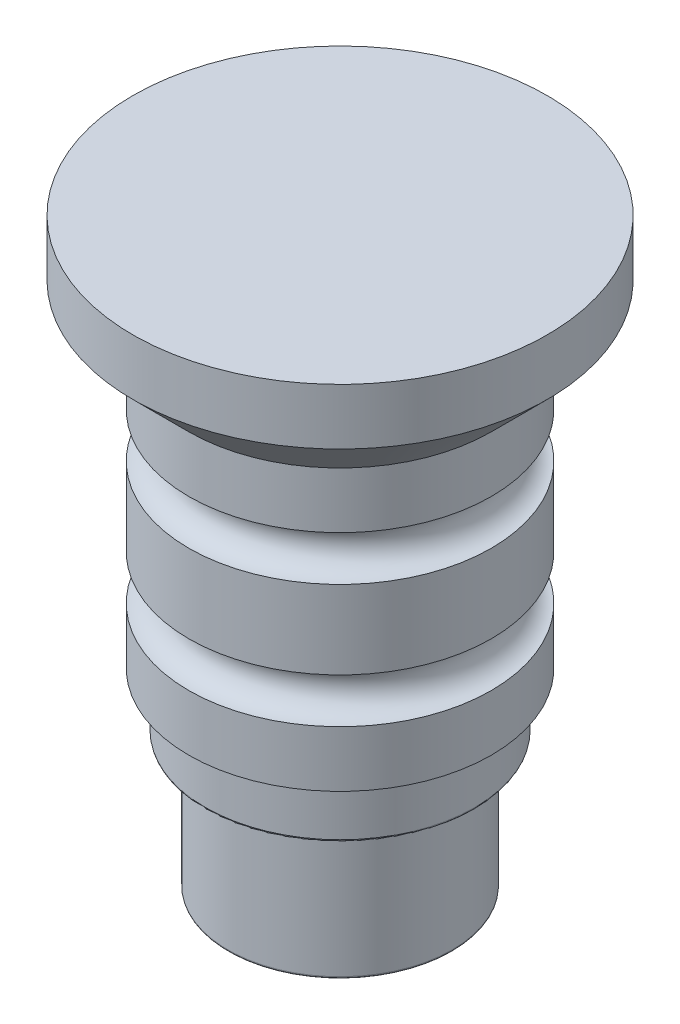
ISO-10303-21;
HEADER;
FILE_DESCRIPTION(('STEP AP214'),'2;1');
FILE_NAME('part.step','',(''),(''),'','','');
FILE_SCHEMA(('AUTOMOTIVE_DESIGN { 1 0 10303 214 1 1 1 1 }'));
ENDSEC;
DATA;
#1=APPLICATION_CONTEXT('core data for automotive mechanical design processes');
#2=APPLICATION_PROTOCOL_DEFINITION('international standard','automotive_design',2000,#1);
#3=PRODUCT_CONTEXT('',#1,'mechanical');
#4=PRODUCT('Part','Part','',(#3));
#5=PRODUCT_RELATED_PRODUCT_CATEGORY('part','',(#4));
#6=PRODUCT_DEFINITION_FORMATION('','',#4);
#7=PRODUCT_DEFINITION_CONTEXT('part definition',#1,'design');
#8=PRODUCT_DEFINITION('design','',#6,#7);
#9=PRODUCT_DEFINITION_SHAPE('','',#8);
#10=(LENGTH_UNIT() NAMED_UNIT(*) SI_UNIT(.MILLI.,.METRE.));
#11=(NAMED_UNIT(*) PLANE_ANGLE_UNIT() SI_UNIT($,.RADIAN.));
#12=(NAMED_UNIT(*) SI_UNIT($,.STERADIAN.) SOLID_ANGLE_UNIT());
#13=UNCERTAINTY_MEASURE_WITH_UNIT(LENGTH_MEASURE(1.E-05),#10,'distance_accuracy_value','');
#14=(GEOMETRIC_REPRESENTATION_CONTEXT(3) GLOBAL_UNCERTAINTY_ASSIGNED_CONTEXT((#13)) GLOBAL_UNIT_ASSIGNED_CONTEXT((#10,
#11,#12)) REPRESENTATION_CONTEXT('',''));
#15=CARTESIAN_POINT('',(0.,0.,0.));
#16=DIRECTION('',(0.,0.,1.));
#17=DIRECTION('',(1.,0.,0.));
#18=AXIS2_PLACEMENT_3D('',#15,#16,#17);
#19=CARTESIAN_POINT('',(-7.5,0.,0.));
#20=DIRECTION('',(0.,-1.,0.));
#21=DIRECTION('',(1.,0.,0.));
#22=AXIS2_PLACEMENT_3D('',#19,#20,#21);
#23=PLANE('',#22);
#24=CARTESIAN_POINT('',(0.,0.,0.));
#25=DIRECTION('',(0.,-1.,0.));
#26=DIRECTION('',(1.,0.,0.));
#27=AXIS2_PLACEMENT_3D('',#24,#25,#26);
#28=CIRCLE('',#27,9.8);
#29=CARTESIAN_POINT('',(9.8,0.,0.));
#30=VERTEX_POINT('',#29);
#31=EDGE_CURVE('E42',#30,#30,#28,.T.);
#32=ORIENTED_EDGE('',*,*,#31,.T.);
#33=EDGE_LOOP('',(#32));
#34=FACE_BOUND('',#33,.T.);
#35=ADVANCED_FACE('F35',(#34),#23,.T.);
#36=CARTESIAN_POINT('',(0.,42.,0.));
#37=DIRECTION('',(0.,1.,0.));
#38=DIRECTION('',(-1.,0.,0.));
#39=AXIS2_PLACEMENT_3D('',#36,#37,#38);
#40=CYLINDRICAL_SURFACE('',#39,10.);
#41=CARTESIAN_POINT('',(0.,11.8,0.));
#42=DIRECTION('',(0.,-1.,0.));
#43=DIRECTION('',(1.,0.,0.));
#44=AXIS2_PLACEMENT_3D('',#41,#42,#43);
#45=CIRCLE('',#44,10.);
#46=CARTESIAN_POINT('',(10.,11.8,0.));
#47=VERTEX_POINT('',#46);
#48=EDGE_CURVE('E46',#47,#47,#45,.T.);
#49=ORIENTED_EDGE('',*,*,#48,.T.);
#50=EDGE_LOOP('',(#49));
#51=FACE_BOUND('',#50,.T.);
#52=CARTESIAN_POINT('',(0.,0.199999999999999,0.));
#53=DIRECTION('',(0.,-1.,0.));
#54=DIRECTION('',(1.,0.,0.));
#55=AXIS2_PLACEMENT_3D('',#52,#53,#54);
#56=CIRCLE('',#55,10.);
#57=CARTESIAN_POINT('',(10.,0.199999999999999,0.));
#58=VERTEX_POINT('',#57);
#59=EDGE_CURVE('E50',#58,#58,#56,.F.);
#60=ORIENTED_EDGE('',*,*,#59,.T.);
#61=EDGE_LOOP('',(#60));
#62=FACE_BOUND('',#61,.T.);
#63=ADVANCED_FACE('F106',(#51,#62),#40,.T.);
#64=CARTESIAN_POINT('',(-10.,12.,0.));
#65=DIRECTION('',(0.,-1.,0.));
#66=DIRECTION('',(1.,0.,0.));
#67=AXIS2_PLACEMENT_3D('',#64,#65,#66);
#68=PLANE('',#67);
#69=CARTESIAN_POINT('',(0.,12.,0.));
#70=DIRECTION('',(0.,-1.,0.));
#71=DIRECTION('',(1.,0.,0.));
#72=AXIS2_PLACEMENT_3D('',#69,#70,#71);
#73=CIRCLE('',#72,10.2);
#74=CARTESIAN_POINT('',(10.2,12.,0.));
#75=VERTEX_POINT('',#74);
#76=EDGE_CURVE('E55',#75,#75,#73,.F.);
#77=ORIENTED_EDGE('',*,*,#76,.T.);
#78=EDGE_LOOP('',(#77));
#79=FACE_BOUND('',#78,.T.);
#80=CARTESIAN_POINT('',(0.,12.,0.));
#81=DIRECTION('',(0.,-1.,0.));
#82=DIRECTION('',(1.,0.,0.));
#83=AXIS2_PLACEMENT_3D('',#80,#81,#82);
#84=CIRCLE('',#83,11.8);
#85=CARTESIAN_POINT('',(11.8,12.,0.));
#86=VERTEX_POINT('',#85);
#87=EDGE_CURVE('E58',#86,#86,#84,.T.);
#88=ORIENTED_EDGE('',*,*,#87,.T.);
#89=EDGE_LOOP('',(#88));
#90=FACE_BOUND('',#89,.T.);
#91=ADVANCED_FACE('F111',(#79,#90),#68,.T.);
#92=CARTESIAN_POINT('',(0.,42.,0.));
#93=DIRECTION('',(0.,1.,0.));
#94=DIRECTION('',(-1.,0.,0.));
#95=AXIS2_PLACEMENT_3D('',#92,#93,#94);
#96=CYLINDRICAL_SURFACE('',#95,12.);
#97=CARTESIAN_POINT('',(0.,12.2,0.));
#98=DIRECTION('',(0.,-1.,0.));
#99=DIRECTION('',(1.,0.,0.));
#100=AXIS2_PLACEMENT_3D('',#97,#98,#99);
#101=CIRCLE('',#100,12.);
#102=CARTESIAN_POINT('',(12.,12.2,0.));
#103=VERTEX_POINT('',#102);
#104=EDGE_CURVE('E10',#103,#103,#101,.F.);
#105=ORIENTED_EDGE('',*,*,#104,.T.);
#106=EDGE_LOOP('',(#105));
#107=FACE_BOUND('',#106,.T.);
#108=CARTESIAN_POINT('',(0.,17.,0.));
#109=DIRECTION('',(0.,1.,0.));
#110=DIRECTION('',(-1.,0.,0.));
#111=AXIS2_PLACEMENT_3D('',#108,#109,#110);
#112=CIRCLE('',#111,12.);
#113=CARTESIAN_POINT('',(-12.,17.,0.));
#114=VERTEX_POINT('',#113);
#115=EDGE_CURVE('E61',#114,#114,#112,.T.);
#116=ORIENTED_EDGE('',*,*,#115,.F.);
#117=EDGE_LOOP('',(#116));
#118=FACE_BOUND('',#117,.T.);
#119=ADVANCED_FACE('F134',(#107,#118),#96,.T.);
#120=CARTESIAN_POINT('',(-12.,17.,0.));
#121=DIRECTION('',(0.,-1.,0.));
#122=DIRECTION('',(1.,0.,0.));
#123=AXIS2_PLACEMENT_3D('',#120,#121,#122);
#124=PLANE('',#123);
#125=ORIENTED_EDGE('',*,*,#115,.T.);
#126=EDGE_LOOP('',(#125));
#127=FACE_BOUND('',#126,.T.);
#128=CARTESIAN_POINT('',(0.,17.,0.));
#129=DIRECTION('',(0.,1.,0.));
#130=DIRECTION('',(-1.,0.,0.));
#131=AXIS2_PLACEMENT_3D('',#128,#129,#130);
#132=CIRCLE('',#131,13.5);
#133=CARTESIAN_POINT('',(-13.5,17.,0.));
#134=VERTEX_POINT('',#133);
#135=EDGE_CURVE('E64',#134,#134,#132,.T.);
#136=ORIENTED_EDGE('',*,*,#135,.F.);
#137=EDGE_LOOP('',(#136));
#138=FACE_BOUND('',#137,.T.);
#139=ADVANCED_FACE('F139',(#127,#138),#124,.T.);
#140=CARTESIAN_POINT('',(0.,42.,0.));
#141=DIRECTION('',(0.,1.,0.));
#142=DIRECTION('',(-1.,0.,0.));
#143=AXIS2_PLACEMENT_3D('',#140,#141,#142);
#144=CYLINDRICAL_SURFACE('',#143,13.5);
#145=ORIENTED_EDGE('',*,*,#135,.T.);
#146=EDGE_LOOP('',(#145));
#147=FACE_BOUND('',#146,.T.);
#148=CARTESIAN_POINT('',(0.,22.,0.));
#149=DIRECTION('',(0.,1.,0.));
#150=DIRECTION('',(-1.,0.,0.));
#151=AXIS2_PLACEMENT_3D('',#148,#149,#150);
#152=CIRCLE('',#151,13.5);
#153=CARTESIAN_POINT('',(-13.5,22.,0.));
#154=VERTEX_POINT('',#153);
#155=EDGE_CURVE('E67',#154,#154,#152,.T.);
#156=ORIENTED_EDGE('',*,*,#155,.F.);
#157=EDGE_LOOP('',(#156));
#158=FACE_BOUND('',#157,.T.);
#159=ADVANCED_FACE('F144',(#147,#158),#144,.T.);
#160=CARTESIAN_POINT('',(0.,24.,0.));
#161=DIRECTION('',(0.,1.,0.));
#162=DIRECTION('',(-1.,0.,0.));
#163=AXIS2_PLACEMENT_3D('',#160,#161,#162);
#164=TOROIDAL_SURFACE('',#163,13.5,2.);
#165=ORIENTED_EDGE('',*,*,#155,.T.);
#166=EDGE_LOOP('',(#165));
#167=FACE_BOUND('',#166,.T.);
#168=CARTESIAN_POINT('',(0.,26.,0.));
#169=DIRECTION('',(0.,1.,0.));
#170=DIRECTION('',(-1.,0.,0.));
#171=AXIS2_PLACEMENT_3D('',#168,#169,#170);
#172=CIRCLE('',#171,13.5);
#173=CARTESIAN_POINT('',(-13.5,26.,0.));
#174=VERTEX_POINT('',#173);
#175=EDGE_CURVE('E70',#174,#174,#172,.T.);
#176=ORIENTED_EDGE('',*,*,#175,.F.);
#177=EDGE_LOOP('',(#176));
#178=FACE_BOUND('',#177,.T.);
#179=ADVANCED_FACE('F148',(#167,#178),#164,.F.);
#180=CARTESIAN_POINT('',(0.,42.,0.));
#181=DIRECTION('',(0.,1.,0.));
#182=DIRECTION('',(-1.,0.,0.));
#183=AXIS2_PLACEMENT_3D('',#180,#181,#182);
#184=CYLINDRICAL_SURFACE('',#183,13.5);
#185=ORIENTED_EDGE('',*,*,#175,.T.);
#186=EDGE_LOOP('',(#185));
#187=FACE_BOUND('',#186,.T.);
#188=CARTESIAN_POINT('',(0.,33.,0.));
#189=DIRECTION('',(0.,1.,0.));
#190=DIRECTION('',(-1.,0.,0.));
#191=AXIS2_PLACEMENT_3D('',#188,#189,#190);
#192=CIRCLE('',#191,13.5);
#193=CARTESIAN_POINT('',(-13.5,33.,0.));
#194=VERTEX_POINT('',#193);
#195=EDGE_CURVE('E73',#194,#194,#192,.T.);
#196=ORIENTED_EDGE('',*,*,#195,.F.);
#197=EDGE_LOOP('',(#196));
#198=FACE_BOUND('',#197,.T.);
#199=ADVANCED_FACE('F152',(#187,#198),#184,.T.);
#200=CARTESIAN_POINT('',(0.,35.,0.));
#201=DIRECTION('',(0.,1.,0.));
#202=DIRECTION('',(-1.,0.,0.));
#203=AXIS2_PLACEMENT_3D('',#200,#201,#202);
#204=TOROIDAL_SURFACE('',#203,13.5,2.);
#205=ORIENTED_EDGE('',*,*,#195,.T.);
#206=EDGE_LOOP('',(#205));
#207=FACE_BOUND('',#206,.T.);
#208=CARTESIAN_POINT('',(0.,37.,0.));
#209=DIRECTION('',(0.,1.,0.));
#210=DIRECTION('',(-1.,0.,0.));
#211=AXIS2_PLACEMENT_3D('',#208,#209,#210);
#212=CIRCLE('',#211,13.5);
#213=CARTESIAN_POINT('',(-13.5,37.,0.));
#214=VERTEX_POINT('',#213);
#215=EDGE_CURVE('E76',#214,#214,#212,.T.);
#216=ORIENTED_EDGE('',*,*,#215,.F.);
#217=EDGE_LOOP('',(#216));
#218=FACE_BOUND('',#217,.T.);
#219=ADVANCED_FACE('F156',(#207,#218),#204,.F.);
#220=CARTESIAN_POINT('',(0.,42.,0.));
#221=DIRECTION('',(0.,1.,0.));
#222=DIRECTION('',(-1.,0.,0.));
#223=AXIS2_PLACEMENT_3D('',#220,#221,#222);
#224=CYLINDRICAL_SURFACE('',#223,13.5);
#225=ORIENTED_EDGE('',*,*,#215,.T.);
#226=EDGE_LOOP('',(#225));
#227=FACE_BOUND('',#226,.T.);
#228=CARTESIAN_POINT('',(0.,42.,0.));
#229=DIRECTION('',(0.,1.,0.));
#230=DIRECTION('',(-1.,0.,0.));
#231=AXIS2_PLACEMENT_3D('',#228,#229,#230);
#232=CIRCLE('',#231,13.5);
#233=CARTESIAN_POINT('',(-13.5,42.,0.));
#234=VERTEX_POINT('',#233);
#235=EDGE_CURVE('E79',#234,#234,#232,.T.);
#236=ORIENTED_EDGE('',*,*,#235,.F.);
#237=EDGE_LOOP('',(#236));
#238=FACE_BOUND('',#237,.T.);
#239=ADVANCED_FACE('F102',(#227,#238),#224,.T.);
#240=CARTESIAN_POINT('',(0.,47.,0.));
#241=DIRECTION('',(0.,1.,0.));
#242=DIRECTION('',(-1.,0.,0.));
#243=AXIS2_PLACEMENT_3D('',#240,#241,#242);
#244=CONICAL_SURFACE('',#243,18.5000000000001,0.785398163397453);
#245=ORIENTED_EDGE('',*,*,#235,.T.);
#246=EDGE_LOOP('',(#245));
#247=FACE_BOUND('',#246,.T.);
#248=CARTESIAN_POINT('',(0.,47.,0.));
#249=DIRECTION('',(0.,1.,0.));
#250=DIRECTION('',(-1.,0.,0.));
#251=AXIS2_PLACEMENT_3D('',#248,#249,#250);
#252=CIRCLE('',#251,18.5000000000001);
#253=CARTESIAN_POINT('',(-18.5000000000001,47.,0.));
#254=VERTEX_POINT('',#253);
#255=EDGE_CURVE('E82',#254,#254,#252,.T.);
#256=ORIENTED_EDGE('',*,*,#255,.F.);
#257=EDGE_LOOP('',(#256));
#258=FACE_BOUND('',#257,.T.);
#259=ADVANCED_FACE('F93',(#247,#258),#244,.T.);
#260=CARTESIAN_POINT('',(0.,42.,0.));
#261=DIRECTION('',(0.,1.,0.));
#262=DIRECTION('',(-1.,0.,0.));
#263=AXIS2_PLACEMENT_3D('',#260,#261,#262);
#264=CYLINDRICAL_SURFACE('',#263,18.5000000000001);
#265=ORIENTED_EDGE('',*,*,#255,.T.);
#266=EDGE_LOOP('',(#265));
#267=FACE_BOUND('',#266,.T.);
#268=CARTESIAN_POINT('',(0.,52.,0.));
#269=DIRECTION('',(0.,1.,0.));
#270=DIRECTION('',(-1.,0.,0.));
#271=AXIS2_PLACEMENT_3D('',#268,#269,#270);
#272=CIRCLE('',#271,18.5000000000001);
#273=CARTESIAN_POINT('',(-18.5000000000001,52.,0.));
#274=VERTEX_POINT('',#273);
#275=EDGE_CURVE('E85',#274,#274,#272,.T.);
#276=ORIENTED_EDGE('',*,*,#275,.F.);
#277=EDGE_LOOP('',(#276));
#278=FACE_BOUND('',#277,.T.);
#279=ADVANCED_FACE('F91',(#267,#278),#264,.T.);
#280=CARTESIAN_POINT('',(-18.5000000000001,52.,0.));
#281=DIRECTION('',(0.,1.,0.));
#282=DIRECTION('',(-1.,0.,0.));
#283=AXIS2_PLACEMENT_3D('',#280,#281,#282);
#284=PLANE('',#283);
#285=ORIENTED_EDGE('',*,*,#275,.T.);
#286=EDGE_LOOP('',(#285));
#287=FACE_BOUND('',#286,.T.);
#288=ADVANCED_FACE('F89',(#287),#284,.T.);
#289=CARTESIAN_POINT('',(0.,11.8,0.));
#290=DIRECTION('',(0.,-1.,0.));
#291=DIRECTION('',(1.,0.,0.));
#292=AXIS2_PLACEMENT_3D('',#289,#290,#291);
#293=TOROIDAL_SURFACE('',#292,10.2,0.2);
#294=ORIENTED_EDGE('',*,*,#48,.F.);
#295=EDGE_LOOP('',(#294));
#296=FACE_BOUND('',#295,.T.);
#297=ORIENTED_EDGE('',*,*,#76,.F.);
#298=EDGE_LOOP('',(#297));
#299=FACE_BOUND('',#298,.T.);
#300=ADVANCED_FACE('F100',(#296,#299),#293,.F.);
#301=CARTESIAN_POINT('',(0.,0.199999999999999,0.));
#302=DIRECTION('',(0.,-1.,0.));
#303=DIRECTION('',(1.,0.,0.));
#304=AXIS2_PLACEMENT_3D('',#301,#302,#303);
#305=TOROIDAL_SURFACE('',#304,9.8,0.2);
#306=ORIENTED_EDGE('',*,*,#31,.F.);
#307=EDGE_LOOP('',(#306));
#308=FACE_BOUND('',#307,.T.);
#309=ORIENTED_EDGE('',*,*,#59,.F.);
#310=EDGE_LOOP('',(#309));
#311=FACE_BOUND('',#310,.T.);
#312=ADVANCED_FACE('F117',(#308,#311),#305,.T.);
#313=CARTESIAN_POINT('',(0.,12.2,0.));
#314=DIRECTION('',(0.,-1.,0.));
#315=DIRECTION('',(1.,0.,0.));
#316=AXIS2_PLACEMENT_3D('',#313,#314,#315);
#317=TOROIDAL_SURFACE('',#316,11.8,0.2);
#318=ORIENTED_EDGE('',*,*,#87,.F.);
#319=EDGE_LOOP('',(#318));
#320=FACE_BOUND('',#319,.T.);
#321=ORIENTED_EDGE('',*,*,#104,.F.);
#322=EDGE_LOOP('',(#321));
#323=FACE_BOUND('',#322,.T.);
#324=ADVANCED_FACE('F37',(#320,#323),#317,.T.);
#325=CLOSED_SHELL('',(#35,#63,#91,#119,#139,#159,#179,#199,#219,#239,#259,#279,#288,#300,#312,#324));
#326=MANIFOLD_SOLID_BREP('B2',#325);
#327=ADVANCED_BREP_SHAPE_REPRESENTATION('',(#18,#326),#14);
#328=SHAPE_DEFINITION_REPRESENTATION(#9,#327);
ENDSEC;
END-ISO-10303-21;
